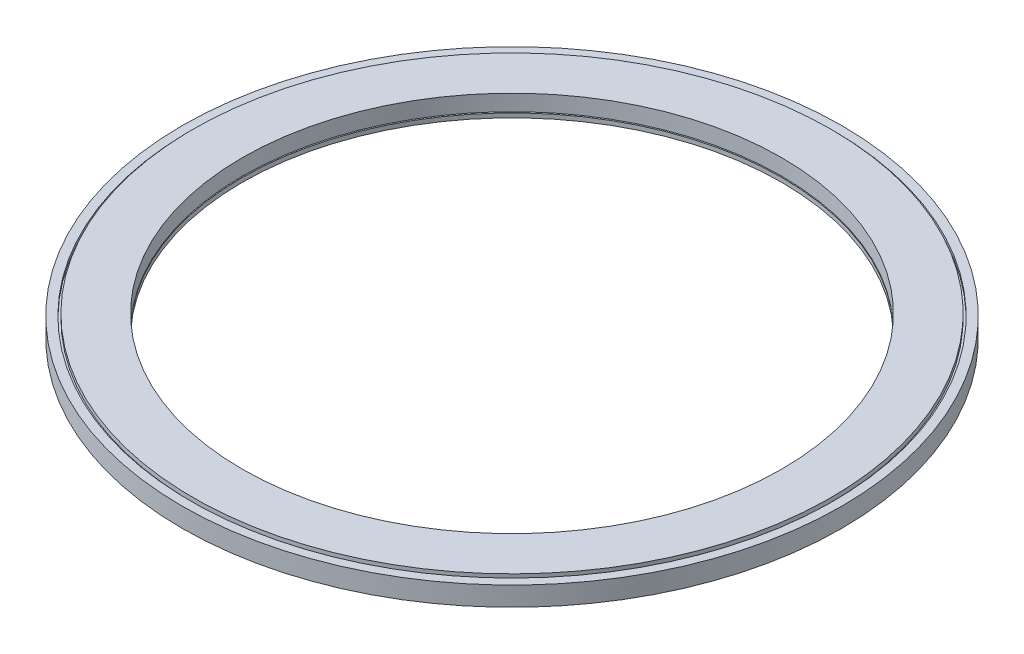
ISO-10303-21;
HEADER;
FILE_DESCRIPTION(('STEP AP214'),'2;1');
FILE_NAME('part.step','',(''),(''),'','','');
FILE_SCHEMA(('AUTOMOTIVE_DESIGN { 1 0 10303 214 1 1 1 1 }'));
ENDSEC;
DATA;
#1=APPLICATION_CONTEXT('core data for automotive mechanical design processes');
#2=APPLICATION_PROTOCOL_DEFINITION('international standard','automotive_design',2000,#1);
#3=PRODUCT_CONTEXT('',#1,'mechanical');
#4=PRODUCT('Part','Part','',(#3));
#5=PRODUCT_RELATED_PRODUCT_CATEGORY('part','',(#4));
#6=PRODUCT_DEFINITION_FORMATION('','',#4);
#7=PRODUCT_DEFINITION_CONTEXT('part definition',#1,'design');
#8=PRODUCT_DEFINITION('design','',#6,#7);
#9=PRODUCT_DEFINITION_SHAPE('','',#8);
#10=(LENGTH_UNIT() NAMED_UNIT(*) SI_UNIT(.MILLI.,.METRE.));
#11=(NAMED_UNIT(*) PLANE_ANGLE_UNIT() SI_UNIT($,.RADIAN.));
#12=(NAMED_UNIT(*) SI_UNIT($,.STERADIAN.) SOLID_ANGLE_UNIT());
#13=UNCERTAINTY_MEASURE_WITH_UNIT(LENGTH_MEASURE(1.E-05),#10,'distance_accuracy_value','');
#14=(GEOMETRIC_REPRESENTATION_CONTEXT(3) GLOBAL_UNCERTAINTY_ASSIGNED_CONTEXT((#13)) GLOBAL_UNIT_ASSIGNED_CONTEXT((#10,
#11,#12)) REPRESENTATION_CONTEXT('',''));
#15=CARTESIAN_POINT('',(0.,0.,0.));
#16=DIRECTION('',(0.,0.,1.));
#17=DIRECTION('',(1.,0.,0.));
#18=AXIS2_PLACEMENT_3D('',#15,#16,#17);
#19=CARTESIAN_POINT('',(0.,0.,0.));
#20=DIRECTION('',(0.,-1.,0.));
#21=DIRECTION('',(0.,0.,-1.));
#22=AXIS2_PLACEMENT_3D('',#19,#20,#21);
#23=CYLINDRICAL_SURFACE('',#22,190.5);
#24=CARTESIAN_POINT('',(0.,11.43,0.));
#25=DIRECTION('',(0.,-1.,0.));
#26=DIRECTION('',(0.,0.,-1.));
#27=AXIS2_PLACEMENT_3D('',#24,#25,#26);
#28=CIRCLE('',#27,190.5);
#29=CARTESIAN_POINT('',(0.,11.43,-190.5));
#30=VERTEX_POINT('',#29);
#31=EDGE_CURVE('E75',#30,#30,#28,.T.);
#32=ORIENTED_EDGE('',*,*,#31,.F.);
#33=EDGE_LOOP('',(#32));
#34=FACE_BOUND('',#33,.T.);
#35=CARTESIAN_POINT('',(0.,9.525,0.));
#36=DIRECTION('',(0.,-1.,0.));
#37=DIRECTION('',(0.,0.,-1.));
#38=AXIS2_PLACEMENT_3D('',#35,#36,#37);
#39=CIRCLE('',#38,190.5);
#40=CARTESIAN_POINT('',(0.,9.525,-190.5));
#41=VERTEX_POINT('',#40);
#42=EDGE_CURVE('E11',#41,#41,#39,.T.);
#43=ORIENTED_EDGE('',*,*,#42,.T.);
#44=EDGE_LOOP('',(#43));
#45=FACE_BOUND('',#44,.T.);
#46=ADVANCED_FACE('F41',(#34,#45),#23,.F.);
#47=CARTESIAN_POINT('',(0.,9.525,0.));
#48=DIRECTION('',(0.,-1.,0.));
#49=DIRECTION('',(0.,0.,-1.));
#50=AXIS2_PLACEMENT_3D('',#47,#48,#49);
#51=PLANE('',#50);
#52=ORIENTED_EDGE('',*,*,#42,.F.);
#53=EDGE_LOOP('',(#52));
#54=FACE_BOUND('',#53,.T.);
#55=CARTESIAN_POINT('',(0.,9.525,0.));
#56=DIRECTION('',(0.,-1.,0.));
#57=DIRECTION('',(0.,0.,-1.));
#58=AXIS2_PLACEMENT_3D('',#55,#56,#57);
#59=CIRCLE('',#58,186.182);
#60=CARTESIAN_POINT('',(0.,9.525,-186.182));
#61=VERTEX_POINT('',#60);
#62=EDGE_CURVE('E47',#61,#61,#59,.T.);
#63=ORIENTED_EDGE('',*,*,#62,.T.);
#64=EDGE_LOOP('',(#63));
#65=FACE_BOUND('',#64,.T.);
#66=ADVANCED_FACE('F82',(#54,#65),#51,.F.);
#67=CARTESIAN_POINT('',(0.,0.,0.));
#68=DIRECTION('',(0.,-1.,0.));
#69=DIRECTION('',(0.,0.,-1.));
#70=AXIS2_PLACEMENT_3D('',#67,#68,#69);
#71=CYLINDRICAL_SURFACE('',#70,186.182);
#72=CARTESIAN_POINT('',(0.,7.874,0.));
#73=DIRECTION('',(0.,-1.,0.));
#74=DIRECTION('',(0.,0.,-1.));
#75=AXIS2_PLACEMENT_3D('',#72,#73,#74);
#76=CIRCLE('',#75,186.182);
#77=CARTESIAN_POINT('',(0.,7.874,-186.182));
#78=VERTEX_POINT('',#77);
#79=EDGE_CURVE('E51',#78,#78,#76,.T.);
#80=ORIENTED_EDGE('',*,*,#79,.T.);
#81=EDGE_LOOP('',(#80));
#82=FACE_BOUND('',#81,.T.);
#83=ORIENTED_EDGE('',*,*,#62,.F.);
#84=EDGE_LOOP('',(#83));
#85=FACE_BOUND('',#84,.T.);
#86=ADVANCED_FACE('F86',(#82,#85),#71,.F.);
#87=CARTESIAN_POINT('',(0.,6.35,0.));
#88=DIRECTION('',(0.,-1.,0.));
#89=DIRECTION('',(0.,0.,-1.));
#90=AXIS2_PLACEMENT_3D('',#87,#88,#89);
#91=TOROIDAL_SURFACE('',#90,184.15,2.53999999999998);
#92=ORIENTED_EDGE('',*,*,#79,.F.);
#93=EDGE_LOOP('',(#92));
#94=FACE_BOUND('',#93,.T.);
#95=CARTESIAN_POINT('',(0.,4.826,0.));
#96=DIRECTION('',(0.,-1.,0.));
#97=DIRECTION('',(0.,0.,-1.));
#98=AXIS2_PLACEMENT_3D('',#95,#96,#97);
#99=CIRCLE('',#98,186.182);
#100=CARTESIAN_POINT('',(0.,4.826,-186.182));
#101=VERTEX_POINT('',#100);
#102=EDGE_CURVE('E55',#101,#101,#99,.T.);
#103=ORIENTED_EDGE('',*,*,#102,.T.);
#104=EDGE_LOOP('',(#103));
#105=FACE_BOUND('',#104,.T.);
#106=ADVANCED_FACE('F91',(#94,#105),#91,.F.);
#107=CARTESIAN_POINT('',(0.,0.,0.));
#108=DIRECTION('',(0.,-1.,0.));
#109=DIRECTION('',(0.,0.,-1.));
#110=AXIS2_PLACEMENT_3D('',#107,#108,#109);
#111=CYLINDRICAL_SURFACE('',#110,186.182);
#112=ORIENTED_EDGE('',*,*,#102,.F.);
#113=EDGE_LOOP('',(#112));
#114=FACE_BOUND('',#113,.T.);
#115=CARTESIAN_POINT('',(0.,2.54,0.));
#116=DIRECTION('',(0.,-1.,0.));
#117=DIRECTION('',(0.,0.,-1.));
#118=AXIS2_PLACEMENT_3D('',#115,#116,#117);
#119=CIRCLE('',#118,186.182);
#120=CARTESIAN_POINT('',(0.,2.54,-186.182));
#121=VERTEX_POINT('',#120);
#122=EDGE_CURVE('E60',#121,#121,#119,.T.);
#123=ORIENTED_EDGE('',*,*,#122,.T.);
#124=EDGE_LOOP('',(#123));
#125=FACE_BOUND('',#124,.T.);
#126=ADVANCED_FACE('F97',(#114,#125),#111,.F.);
#127=CARTESIAN_POINT('',(0.,2.54,0.));
#128=DIRECTION('',(0.,-1.,0.));
#129=DIRECTION('',(0.,0.,-1.));
#130=AXIS2_PLACEMENT_3D('',#127,#128,#129);
#131=PLANE('',#130);
#132=ORIENTED_EDGE('',*,*,#122,.F.);
#133=EDGE_LOOP('',(#132));
#134=FACE_BOUND('',#133,.T.);
#135=CARTESIAN_POINT('',(0.,2.54,0.));
#136=DIRECTION('',(0.,-1.,0.));
#137=DIRECTION('',(0.,0.,-1.));
#138=AXIS2_PLACEMENT_3D('',#135,#136,#137);
#139=CIRCLE('',#138,160.02);
#140=CARTESIAN_POINT('',(0.,2.54,-160.02));
#141=VERTEX_POINT('',#140);
#142=EDGE_CURVE('E63',#141,#141,#139,.T.);
#143=ORIENTED_EDGE('',*,*,#142,.T.);
#144=EDGE_LOOP('',(#143));
#145=FACE_BOUND('',#144,.T.);
#146=ADVANCED_FACE('F101',(#134,#145),#131,.F.);
#147=CARTESIAN_POINT('',(0.,0.,0.));
#148=DIRECTION('',(0.,-1.,0.));
#149=DIRECTION('',(0.,0.,-1.));
#150=AXIS2_PLACEMENT_3D('',#147,#148,#149);
#151=CYLINDRICAL_SURFACE('',#150,160.02);
#152=ORIENTED_EDGE('',*,*,#142,.F.);
#153=EDGE_LOOP('',(#152));
#154=FACE_BOUND('',#153,.T.);
#155=CARTESIAN_POINT('',(0.,0.,0.));
#156=DIRECTION('',(0.,-1.,0.));
#157=DIRECTION('',(0.,0.,-1.));
#158=AXIS2_PLACEMENT_3D('',#155,#156,#157);
#159=CIRCLE('',#158,160.02);
#160=CARTESIAN_POINT('',(0.,0.,-160.02));
#161=VERTEX_POINT('',#160);
#162=EDGE_CURVE('E66',#161,#161,#159,.T.);
#163=ORIENTED_EDGE('',*,*,#162,.T.);
#164=EDGE_LOOP('',(#163));
#165=FACE_BOUND('',#164,.T.);
#166=ADVANCED_FACE('F105',(#154,#165),#151,.F.);
#167=CARTESIAN_POINT('',(0.,0.,0.));
#168=DIRECTION('',(0.,1.,0.));
#169=DIRECTION('',(0.,0.,1.));
#170=AXIS2_PLACEMENT_3D('',#167,#168,#169);
#171=PLANE('',#170);
#172=ORIENTED_EDGE('',*,*,#162,.F.);
#173=EDGE_LOOP('',(#172));
#174=FACE_BOUND('',#173,.T.);
#175=CARTESIAN_POINT('',(0.,0.,0.));
#176=DIRECTION('',(0.,-1.,0.));
#177=DIRECTION('',(0.,0.,-1.));
#178=AXIS2_PLACEMENT_3D('',#175,#176,#177);
#179=CIRCLE('',#178,195.58);
#180=CARTESIAN_POINT('',(0.,0.,-195.58));
#181=VERTEX_POINT('',#180);
#182=EDGE_CURVE('E69',#181,#181,#179,.T.);
#183=ORIENTED_EDGE('',*,*,#182,.T.);
#184=EDGE_LOOP('',(#183));
#185=FACE_BOUND('',#184,.T.);
#186=ADVANCED_FACE('F109',(#174,#185),#171,.F.);
#187=CARTESIAN_POINT('',(0.,0.,0.));
#188=DIRECTION('',(0.,-1.,0.));
#189=DIRECTION('',(0.,0.,-1.));
#190=AXIS2_PLACEMENT_3D('',#187,#188,#189);
#191=CYLINDRICAL_SURFACE('',#190,195.58);
#192=ORIENTED_EDGE('',*,*,#182,.F.);
#193=EDGE_LOOP('',(#192));
#194=FACE_BOUND('',#193,.T.);
#195=CARTESIAN_POINT('',(0.,11.43,0.));
#196=DIRECTION('',(0.,-1.,0.));
#197=DIRECTION('',(0.,0.,-1.));
#198=AXIS2_PLACEMENT_3D('',#195,#196,#197);
#199=CIRCLE('',#198,195.58);
#200=CARTESIAN_POINT('',(0.,11.43,-195.58));
#201=VERTEX_POINT('',#200);
#202=EDGE_CURVE('E72',#201,#201,#199,.T.);
#203=ORIENTED_EDGE('',*,*,#202,.T.);
#204=EDGE_LOOP('',(#203));
#205=FACE_BOUND('',#204,.T.);
#206=ADVANCED_FACE('F113',(#194,#205),#191,.T.);
#207=CARTESIAN_POINT('',(0.,11.43,0.));
#208=DIRECTION('',(0.,-1.,0.));
#209=DIRECTION('',(0.,0.,-1.));
#210=AXIS2_PLACEMENT_3D('',#207,#208,#209);
#211=PLANE('',#210);
#212=ORIENTED_EDGE('',*,*,#202,.F.);
#213=EDGE_LOOP('',(#212));
#214=FACE_BOUND('',#213,.T.);
#215=ORIENTED_EDGE('',*,*,#31,.T.);
#216=EDGE_LOOP('',(#215));
#217=FACE_BOUND('',#216,.T.);
#218=ADVANCED_FACE('F79',(#214,#217),#211,.F.);
#219=CLOSED_SHELL('',(#46,#66,#86,#106,#126,#146,#166,#186,#206,#218));
#220=MANIFOLD_SOLID_BREP('B2',#219);
#221=CARTESIAN_POINT('',(0.,6.35,0.));
#222=DIRECTION('',(0.,-1.,0.));
#223=DIRECTION('',(0.,0.,-1.));
#224=AXIS2_PLACEMENT_3D('',#221,#222,#223);
#225=TOROIDAL_SURFACE('',#224,184.15,2.53999999999998);
#226=CARTESIAN_POINT('',(0.,3.81000000000002,0.));
#227=DIRECTION('',(0.,-1.,0.));
#228=DIRECTION('',(0.,0.,-1.));
#229=AXIS2_PLACEMENT_3D('',#226,#227,#228);
#230=CIRCLE('',#229,184.15);
#231=CARTESIAN_POINT('',(0.,3.81000000000002,-184.15));
#232=VERTEX_POINT('',#231);
#233=EDGE_CURVE('E230',#232,#232,#230,.T.);
#234=ORIENTED_EDGE('',*,*,#233,.F.);
#235=EDGE_LOOP('',(#234));
#236=FACE_BOUND('',#235,.T.);
#237=CARTESIAN_POINT('',(0.,8.88999999999998,0.));
#238=DIRECTION('',(0.,-1.,0.));
#239=DIRECTION('',(0.,0.,-1.));
#240=AXIS2_PLACEMENT_3D('',#237,#238,#239);
#241=CIRCLE('',#240,184.15);
#242=CARTESIAN_POINT('',(0.,8.88999999999998,-184.15));
#243=VERTEX_POINT('',#242);
#244=EDGE_CURVE('E40',#243,#243,#241,.T.);
#245=ORIENTED_EDGE('',*,*,#244,.T.);
#246=EDGE_LOOP('',(#245));
#247=FACE_BOUND('',#246,.T.);
#248=ADVANCED_FACE('F202',(#236,#247),#225,.F.);
#249=CARTESIAN_POINT('',(0.,0.,0.));
#250=DIRECTION('',(0.,-1.,0.));
#251=DIRECTION('',(0.,0.,-1.));
#252=AXIS2_PLACEMENT_3D('',#249,#250,#251);
#253=CYLINDRICAL_SURFACE('',#252,184.15);
#254=CARTESIAN_POINT('',(0.,9.525,0.));
#255=DIRECTION('',(0.,-1.,0.));
#256=DIRECTION('',(0.,0.,-1.));
#257=AXIS2_PLACEMENT_3D('',#254,#255,#256);
#258=CIRCLE('',#257,184.15);
#259=CARTESIAN_POINT('',(0.,9.525,-184.15));
#260=VERTEX_POINT('',#259);
#261=EDGE_CURVE('E208',#260,#260,#258,.T.);
#262=ORIENTED_EDGE('',*,*,#261,.T.);
#263=EDGE_LOOP('',(#262));
#264=FACE_BOUND('',#263,.T.);
#265=ORIENTED_EDGE('',*,*,#244,.F.);
#266=EDGE_LOOP('',(#265));
#267=FACE_BOUND('',#266,.T.);
#268=ADVANCED_FACE('F238',(#264,#267),#253,.T.);
#269=CARTESIAN_POINT('',(0.,9.525,0.));
#270=DIRECTION('',(0.,-1.,0.));
#271=DIRECTION('',(0.,0.,-1.));
#272=AXIS2_PLACEMENT_3D('',#269,#270,#271);
#273=PLANE('',#272);
#274=ORIENTED_EDGE('',*,*,#261,.F.);
#275=EDGE_LOOP('',(#274));
#276=FACE_BOUND('',#275,.T.);
#277=CARTESIAN_POINT('',(0.,9.525,0.));
#278=DIRECTION('',(0.,-1.,0.));
#279=DIRECTION('',(0.,0.,-1.));
#280=AXIS2_PLACEMENT_3D('',#277,#278,#279);
#281=CIRCLE('',#280,171.45);
#282=CARTESIAN_POINT('',(0.,9.525,-171.45));
#283=VERTEX_POINT('',#282);
#284=EDGE_CURVE('E212',#283,#283,#281,.T.);
#285=ORIENTED_EDGE('',*,*,#284,.T.);
#286=EDGE_LOOP('',(#285));
#287=FACE_BOUND('',#286,.T.);
#288=ADVANCED_FACE('F242',(#276,#287),#273,.F.);
#289=CARTESIAN_POINT('',(0.,0.,0.));
#290=DIRECTION('',(0.,-1.,0.));
#291=DIRECTION('',(0.,0.,-1.));
#292=AXIS2_PLACEMENT_3D('',#289,#290,#291);
#293=CYLINDRICAL_SURFACE('',#292,171.45);
#294=ORIENTED_EDGE('',*,*,#284,.F.);
#295=EDGE_LOOP('',(#294));
#296=FACE_BOUND('',#295,.T.);
#297=CARTESIAN_POINT('',(0.,8.88999999999998,0.));
#298=DIRECTION('',(0.,-1.,0.));
#299=DIRECTION('',(0.,0.,-1.));
#300=AXIS2_PLACEMENT_3D('',#297,#298,#299);
#301=CIRCLE('',#300,171.45);
#302=CARTESIAN_POINT('',(0.,8.88999999999998,-171.45));
#303=VERTEX_POINT('',#302);
#304=EDGE_CURVE('E216',#303,#303,#301,.T.);
#305=ORIENTED_EDGE('',*,*,#304,.T.);
#306=EDGE_LOOP('',(#305));
#307=FACE_BOUND('',#306,.T.);
#308=ADVANCED_FACE('F247',(#296,#307),#293,.F.);
#309=CARTESIAN_POINT('',(0.,6.35,0.));
#310=DIRECTION('',(0.,-1.,0.));
#311=DIRECTION('',(0.,0.,-1.));
#312=AXIS2_PLACEMENT_3D('',#309,#310,#311);
#313=TOROIDAL_SURFACE('',#312,171.45,2.53999999999998);
#314=ORIENTED_EDGE('',*,*,#304,.F.);
#315=EDGE_LOOP('',(#314));
#316=FACE_BOUND('',#315,.T.);
#317=CARTESIAN_POINT('',(0.,3.81000000000002,0.));
#318=DIRECTION('',(0.,-1.,0.));
#319=DIRECTION('',(0.,0.,-1.));
#320=AXIS2_PLACEMENT_3D('',#317,#318,#319);
#321=CIRCLE('',#320,171.45);
#322=CARTESIAN_POINT('',(0.,3.81000000000002,-171.45));
#323=VERTEX_POINT('',#322);
#324=EDGE_CURVE('E221',#323,#323,#321,.T.);
#325=ORIENTED_EDGE('',*,*,#324,.T.);
#326=EDGE_LOOP('',(#325));
#327=FACE_BOUND('',#326,.T.);
#328=ADVANCED_FACE('F261',(#316,#327),#313,.F.);
#329=ORIENTED_EDGE('',*,*,#324,.F.);
#330=EDGE_LOOP('',(#329));
#331=FACE_BOUND('',#330,.T.);
#332=CARTESIAN_POINT('',(0.,3.175,0.));
#333=DIRECTION('',(0.,-1.,0.));
#334=DIRECTION('',(0.,0.,-1.));
#335=AXIS2_PLACEMENT_3D('',#332,#333,#334);
#336=CIRCLE('',#335,171.45);
#337=CARTESIAN_POINT('',(0.,3.175,-171.45));
#338=VERTEX_POINT('',#337);
#339=EDGE_CURVE('E224',#338,#338,#336,.T.);
#340=ORIENTED_EDGE('',*,*,#339,.T.);
#341=EDGE_LOOP('',(#340));
#342=FACE_BOUND('',#341,.T.);
#343=ADVANCED_FACE('F256',(#331,#342),#293,.F.);
#344=CARTESIAN_POINT('',(0.,3.175,0.));
#345=DIRECTION('',(0.,-1.,0.));
#346=DIRECTION('',(0.,0.,-1.));
#347=AXIS2_PLACEMENT_3D('',#344,#345,#346);
#348=PLANE('',#347);
#349=CARTESIAN_POINT('',(0.,3.175,0.));
#350=DIRECTION('',(0.,-1.,0.));
#351=DIRECTION('',(0.,0.,-1.));
#352=AXIS2_PLACEMENT_3D('',#349,#350,#351);
#353=CIRCLE('',#352,184.15);
#354=CARTESIAN_POINT('',(0.,3.175,-184.15));
#355=VERTEX_POINT('',#354);
#356=EDGE_CURVE('E227',#355,#355,#353,.T.);
#357=ORIENTED_EDGE('',*,*,#356,.T.);
#358=EDGE_LOOP('',(#357));
#359=FACE_BOUND('',#358,.T.);
#360=ORIENTED_EDGE('',*,*,#339,.F.);
#361=EDGE_LOOP('',(#360));
#362=FACE_BOUND('',#361,.T.);
#363=ADVANCED_FACE('F252',(#359,#362),#348,.T.);
#364=ORIENTED_EDGE('',*,*,#233,.T.);
#365=EDGE_LOOP('',(#364));
#366=FACE_BOUND('',#365,.T.);
#367=ORIENTED_EDGE('',*,*,#356,.F.);
#368=EDGE_LOOP('',(#367));
#369=FACE_BOUND('',#368,.T.);
#370=ADVANCED_FACE('F234',(#366,#369),#253,.T.);
#371=CLOSED_SHELL('',(#248,#268,#288,#308,#328,#343,#363,#370));
#372=MANIFOLD_SOLID_BREP('B6',#371);
#373=CARTESIAN_POINT('',(0.,12.7,0.));
#374=DIRECTION('',(0.,1.,0.));
#375=DIRECTION('',(0.,0.,1.));
#376=AXIS2_PLACEMENT_3D('',#373,#374,#375);
#377=PLANE('',#376);
#378=CARTESIAN_POINT('',(0.,12.7,0.));
#379=DIRECTION('',(0.,-1.,0.));
#380=DIRECTION('',(0.,0.,-1.));
#381=AXIS2_PLACEMENT_3D('',#378,#379,#380);
#382=CIRCLE('',#381,160.02);
#383=CARTESIAN_POINT('',(0.,12.7,-160.02));
#384=VERTEX_POINT('',#383);
#385=EDGE_CURVE('E201',#384,#384,#382,.T.);
#386=ORIENTED_EDGE('',*,*,#385,.T.);
#387=EDGE_LOOP('',(#386));
#388=FACE_BOUND('',#387,.T.);
#389=CARTESIAN_POINT('',(0.,12.7,0.));
#390=DIRECTION('',(0.,-1.,0.));
#391=DIRECTION('',(0.,0.,-1.));
#392=AXIS2_PLACEMENT_3D('',#389,#390,#391);
#393=CIRCLE('',#392,189.23);
#394=CARTESIAN_POINT('',(0.,12.7,-189.23));
#395=VERTEX_POINT('',#394);
#396=EDGE_CURVE('E349',#395,#395,#393,.T.);
#397=ORIENTED_EDGE('',*,*,#396,.F.);
#398=EDGE_LOOP('',(#397));
#399=FACE_BOUND('',#398,.T.);
#400=ADVANCED_FACE('F321',(#388,#399),#377,.T.);
#401=CARTESIAN_POINT('',(0.,0.,0.));
#402=DIRECTION('',(0.,-1.,0.));
#403=DIRECTION('',(0.,0.,-1.));
#404=AXIS2_PLACEMENT_3D('',#401,#402,#403);
#405=CYLINDRICAL_SURFACE('',#404,160.02);
#406=CARTESIAN_POINT('',(0.,3.175,0.));
#407=DIRECTION('',(0.,-1.,0.));
#408=DIRECTION('',(0.,0.,-1.));
#409=AXIS2_PLACEMENT_3D('',#406,#407,#408);
#410=CIRCLE('',#409,160.02);
#411=CARTESIAN_POINT('',(0.,3.175,-160.02));
#412=VERTEX_POINT('',#411);
#413=EDGE_CURVE('E327',#412,#412,#410,.T.);
#414=ORIENTED_EDGE('',*,*,#413,.T.);
#415=EDGE_LOOP('',(#414));
#416=FACE_BOUND('',#415,.T.);
#417=ORIENTED_EDGE('',*,*,#385,.F.);
#418=EDGE_LOOP('',(#417));
#419=FACE_BOUND('',#418,.T.);
#420=ADVANCED_FACE('F357',(#416,#419),#405,.F.);
#421=CARTESIAN_POINT('',(0.,3.175,0.));
#422=DIRECTION('',(0.,-1.,0.));
#423=DIRECTION('',(0.,0.,-1.));
#424=AXIS2_PLACEMENT_3D('',#421,#422,#423);
#425=PLANE('',#424);
#426=CARTESIAN_POINT('',(0.,3.175,0.));
#427=DIRECTION('',(0.,-1.,0.));
#428=DIRECTION('',(0.,0.,-1.));
#429=AXIS2_PLACEMENT_3D('',#426,#427,#428);
#430=CIRCLE('',#429,169.418);
#431=CARTESIAN_POINT('',(0.,3.175,-169.418));
#432=VERTEX_POINT('',#431);
#433=EDGE_CURVE('E331',#432,#432,#430,.T.);
#434=ORIENTED_EDGE('',*,*,#433,.T.);
#435=EDGE_LOOP('',(#434));
#436=FACE_BOUND('',#435,.T.);
#437=ORIENTED_EDGE('',*,*,#413,.F.);
#438=EDGE_LOOP('',(#437));
#439=FACE_BOUND('',#438,.T.);
#440=ADVANCED_FACE('F361',(#436,#439),#425,.T.);
#441=CARTESIAN_POINT('',(0.,0.,0.));
#442=DIRECTION('',(0.,-1.,0.));
#443=DIRECTION('',(0.,0.,-1.));
#444=AXIS2_PLACEMENT_3D('',#441,#442,#443);
#445=CYLINDRICAL_SURFACE('',#444,169.418);
#446=CARTESIAN_POINT('',(0.,4.826,0.));
#447=DIRECTION('',(0.,-1.,0.));
#448=DIRECTION('',(0.,0.,-1.));
#449=AXIS2_PLACEMENT_3D('',#446,#447,#448);
#450=CIRCLE('',#449,169.418);
#451=CARTESIAN_POINT('',(0.,4.826,-169.418));
#452=VERTEX_POINT('',#451);
#453=EDGE_CURVE('E335',#452,#452,#450,.T.);
#454=ORIENTED_EDGE('',*,*,#453,.T.);
#455=EDGE_LOOP('',(#454));
#456=FACE_BOUND('',#455,.T.);
#457=ORIENTED_EDGE('',*,*,#433,.F.);
#458=EDGE_LOOP('',(#457));
#459=FACE_BOUND('',#458,.T.);
#460=ADVANCED_FACE('F365',(#456,#459),#445,.T.);
#461=CARTESIAN_POINT('',(0.,6.35,0.));
#462=DIRECTION('',(0.,-1.,0.));
#463=DIRECTION('',(0.,0.,-1.));
#464=AXIS2_PLACEMENT_3D('',#461,#462,#463);
#465=TOROIDAL_SURFACE('',#464,171.45,2.53999999999998);
#466=ORIENTED_EDGE('',*,*,#453,.F.);
#467=EDGE_LOOP('',(#466));
#468=FACE_BOUND('',#467,.T.);
#469=CARTESIAN_POINT('',(0.,7.874,0.));
#470=DIRECTION('',(0.,-1.,0.));
#471=DIRECTION('',(0.,0.,-1.));
#472=AXIS2_PLACEMENT_3D('',#469,#470,#471);
#473=CIRCLE('',#472,169.418);
#474=CARTESIAN_POINT('',(0.,7.874,-169.418));
#475=VERTEX_POINT('',#474);
#476=EDGE_CURVE('E340',#475,#475,#473,.T.);
#477=ORIENTED_EDGE('',*,*,#476,.T.);
#478=EDGE_LOOP('',(#477));
#479=FACE_BOUND('',#478,.T.);
#480=ADVANCED_FACE('F372',(#468,#479),#465,.F.);
#481=CARTESIAN_POINT('',(0.,0.,0.));
#482=DIRECTION('',(0.,-1.,0.));
#483=DIRECTION('',(0.,0.,-1.));
#484=AXIS2_PLACEMENT_3D('',#481,#482,#483);
#485=CYLINDRICAL_SURFACE('',#484,169.418);
#486=ORIENTED_EDGE('',*,*,#476,.F.);
#487=EDGE_LOOP('',(#486));
#488=FACE_BOUND('',#487,.T.);
#489=CARTESIAN_POINT('',(0.,10.16,0.));
#490=DIRECTION('',(0.,-1.,0.));
#491=DIRECTION('',(0.,0.,-1.));
#492=AXIS2_PLACEMENT_3D('',#489,#490,#491);
#493=CIRCLE('',#492,169.418);
#494=CARTESIAN_POINT('',(0.,10.16,-169.418));
#495=VERTEX_POINT('',#494);
#496=EDGE_CURVE('E343',#495,#495,#493,.T.);
#497=ORIENTED_EDGE('',*,*,#496,.T.);
#498=EDGE_LOOP('',(#497));
#499=FACE_BOUND('',#498,.T.);
#500=ADVANCED_FACE('F376',(#488,#499),#485,.T.);
#501=CARTESIAN_POINT('',(0.,10.16,0.));
#502=DIRECTION('',(0.,-1.,0.));
#503=DIRECTION('',(0.,0.,-1.));
#504=AXIS2_PLACEMENT_3D('',#501,#502,#503);
#505=PLANE('',#504);
#506=CARTESIAN_POINT('',(0.,10.16,0.));
#507=DIRECTION('',(0.,-1.,0.));
#508=DIRECTION('',(0.,0.,-1.));
#509=AXIS2_PLACEMENT_3D('',#506,#507,#508);
#510=CIRCLE('',#509,189.23);
#511=CARTESIAN_POINT('',(0.,10.16,-189.23));
#512=VERTEX_POINT('',#511);
#513=EDGE_CURVE('E346',#512,#512,#510,.T.);
#514=ORIENTED_EDGE('',*,*,#513,.T.);
#515=EDGE_LOOP('',(#514));
#516=FACE_BOUND('',#515,.T.);
#517=ORIENTED_EDGE('',*,*,#496,.F.);
#518=EDGE_LOOP('',(#517));
#519=FACE_BOUND('',#518,.T.);
#520=ADVANCED_FACE('F380',(#516,#519),#505,.T.);
#521=CARTESIAN_POINT('',(0.,0.,0.));
#522=DIRECTION('',(0.,-1.,0.));
#523=DIRECTION('',(0.,0.,-1.));
#524=AXIS2_PLACEMENT_3D('',#521,#522,#523);
#525=CYLINDRICAL_SURFACE('',#524,189.23);
#526=ORIENTED_EDGE('',*,*,#396,.T.);
#527=EDGE_LOOP('',(#526));
#528=FACE_BOUND('',#527,.T.);
#529=ORIENTED_EDGE('',*,*,#513,.F.);
#530=EDGE_LOOP('',(#529));
#531=FACE_BOUND('',#530,.T.);
#532=ADVANCED_FACE('F353',(#528,#531),#525,.T.);
#533=CLOSED_SHELL('',(#400,#420,#440,#460,#480,#500,#520,#532));
#534=MANIFOLD_SOLID_BREP('B35',#533);
#535=ADVANCED_BREP_SHAPE_REPRESENTATION('',(#18,#220,#372,#534),#14);
#536=SHAPE_DEFINITION_REPRESENTATION(#9,#535);
ENDSEC;
END-ISO-10303-21;
